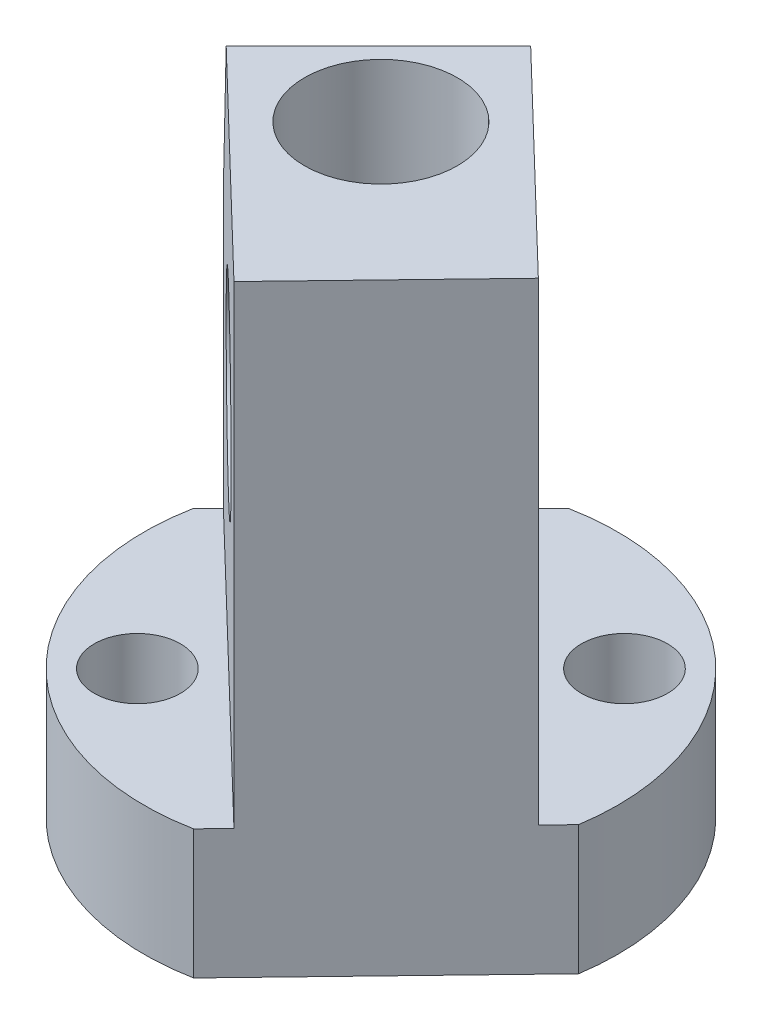
ISO-10303-21;
HEADER;
FILE_DESCRIPTION(('STEP AP214'),'2;1');
FILE_NAME('part.step','',(''),(''),'','','');
FILE_SCHEMA(('AUTOMOTIVE_DESIGN { 1 0 10303 214 1 1 1 1 }'));
ENDSEC;
DATA;
#1=APPLICATION_CONTEXT('core data for automotive mechanical design processes');
#2=APPLICATION_PROTOCOL_DEFINITION('international standard','automotive_design',2000,#1);
#3=PRODUCT_CONTEXT('',#1,'mechanical');
#4=PRODUCT('Part','Part','',(#3));
#5=PRODUCT_RELATED_PRODUCT_CATEGORY('part','',(#4));
#6=PRODUCT_DEFINITION_FORMATION('','',#4);
#7=PRODUCT_DEFINITION_CONTEXT('part definition',#1,'design');
#8=PRODUCT_DEFINITION('design','',#6,#7);
#9=PRODUCT_DEFINITION_SHAPE('','',#8);
#10=(LENGTH_UNIT() NAMED_UNIT(*) SI_UNIT(.MILLI.,.METRE.));
#11=(NAMED_UNIT(*) PLANE_ANGLE_UNIT() SI_UNIT($,.RADIAN.));
#12=(NAMED_UNIT(*) SI_UNIT($,.STERADIAN.) SOLID_ANGLE_UNIT());
#13=UNCERTAINTY_MEASURE_WITH_UNIT(LENGTH_MEASURE(1.E-05),#10,'distance_accuracy_value','');
#14=(GEOMETRIC_REPRESENTATION_CONTEXT(3) GLOBAL_UNCERTAINTY_ASSIGNED_CONTEXT((#13)) GLOBAL_UNIT_ASSIGNED_CONTEXT((#10,
#11,#12)) REPRESENTATION_CONTEXT('',''));
#15=CARTESIAN_POINT('',(0.,0.,0.));
#16=DIRECTION('',(0.,0.,1.));
#17=DIRECTION('',(1.,0.,0.));
#18=AXIS2_PLACEMENT_3D('',#15,#16,#17);
#19=CARTESIAN_POINT('',(0.,6.,0.));
#20=DIRECTION('',(0.,1.,0.));
#21=DIRECTION('',(0.,0.,1.));
#22=AXIS2_PLACEMENT_3D('',#19,#20,#21);
#23=PLANE('',#22);
#24=DIRECTION('',(0.707106781186547,0.,-0.707106781186547));
#25=VECTOR('',#24,1.);
#26=CARTESIAN_POINT('',(0.545569667866749,6.,-13.4058460167802));
#27=LINE('',#26,#25);
#28=CARTESIAN_POINT('',(-10.8065891404101,6.,-2.05368720850336));
#29=VERTEX_POINT('',#28);
#30=CARTESIAN_POINT('',(-10.0887922112917,6.,-2.77148413762175));
#31=VERTEX_POINT('',#30);
#32=EDGE_CURVE('E109',#29,#31,#27,.T.);
#33=ORIENTED_EDGE('',*,*,#32,.F.);
#34=CARTESIAN_POINT('',(0.,6.,0.));
#35=DIRECTION('',(0.,1.,0.));
#36=DIRECTION('',(0.,0.,1.));
#37=AXIS2_PLACEMENT_3D('',#34,#35,#36);
#38=CIRCLE('',#37,11.);
#39=CARTESIAN_POINT('',(2.09784639583294,6.,10.7981035603244));
#40=VERTEX_POINT('',#39);
#41=EDGE_CURVE('E119',#29,#40,#38,.T.);
#42=ORIENTED_EDGE('',*,*,#41,.T.);
#43=DIRECTION('',(-0.693512284784341,0.,0.720444800698293));
#44=VECTOR('',#43,1.);
#45=CARTESIAN_POINT('',(1.20429728995474,6.,11.7263536023532));
#46=LINE('',#45,#44);
#47=CARTESIAN_POINT('',(3.01644178236294,6.,9.84383456655053));
#48=VERTEX_POINT('',#47);
#49=EDGE_CURVE('E230',#48,#40,#46,.T.);
#50=ORIENTED_EDGE('',*,*,#49,.F.);
#51=DIRECTION('',(0.720444800698294,0.,0.69351228478434));
#52=VECTOR('',#51,1.);
#53=CARTESIAN_POINT('',(3.01644178236294,6.,9.84383456655053));
#54=LINE('',#53,#52);
#55=EDGE_CURVE('E122',#31,#48,#54,.T.);
#56=ORIENTED_EDGE('',*,*,#55,.F.);
#57=EDGE_LOOP('',(#33,#42,#50,#56));
#58=FACE_BOUND('',#57,.T.);
#59=CARTESIAN_POINT('',(-5.65685424949238,6.,5.65685424949238));
#60=DIRECTION('',(0.,1.,0.));
#61=DIRECTION('',(0.,0.,1.));
#62=AXIS2_PLACEMENT_3D('',#59,#60,#61);
#63=CIRCLE('',#62,1.99999999999999);
#64=CARTESIAN_POINT('',(-5.65685424949238,6.,7.65685424949237));
#65=VERTEX_POINT('',#64);
#66=EDGE_CURVE('E247',#65,#65,#63,.T.);
#67=ORIENTED_EDGE('',*,*,#66,.F.);
#68=EDGE_LOOP('',(#67));
#69=FACE_BOUND('',#68,.T.);
#70=ADVANCED_FACE('F33',(#58,#69),#23,.T.);
#71=CARTESIAN_POINT('',(0.,0.,0.));
#72=DIRECTION('',(0.,1.,0.));
#73=DIRECTION('',(0.,0.,1.));
#74=AXIS2_PLACEMENT_3D('',#71,#72,#73);
#75=CYLINDRICAL_SURFACE('',#74,11.);
#76=DIRECTION('',(0.,1.,0.));
#77=VECTOR('',#76,1.);
#78=CARTESIAN_POINT('',(-2.05368720850337,0.,-10.8065891404101));
#79=LINE('',#78,#77);
#80=CARTESIAN_POINT('',(-2.05368720850336,6.,-10.8065891404101));
#81=VERTEX_POINT('',#80);
#82=CARTESIAN_POINT('',(-2.05368720850337,0.,-10.8065891404101));
#83=VERTEX_POINT('',#82);
#84=EDGE_CURVE('E114',#81,#83,#79,.F.);
#85=ORIENTED_EDGE('',*,*,#84,.F.);
#86=CARTESIAN_POINT('',(10.8701600167363,6.,1.68511756579372));
#87=VERTEX_POINT('',#86);
#88=EDGE_CURVE('E129',#87,#81,#38,.T.);
#89=ORIENTED_EDGE('',*,*,#88,.F.);
#90=DIRECTION('',(0.,1.,0.));
#91=VECTOR('',#90,1.);
#92=CARTESIAN_POINT('',(10.8701600167363,0.,1.68511756579372));
#93=LINE('',#92,#91);
#94=CARTESIAN_POINT('',(10.8701600167363,0.,1.68511756579373));
#95=VERTEX_POINT('',#94);
#96=EDGE_CURVE('E152',#95,#87,#93,.T.);
#97=ORIENTED_EDGE('',*,*,#96,.F.);
#98=CARTESIAN_POINT('',(0.,0.,0.));
#99=DIRECTION('',(0.,1.,0.));
#100=DIRECTION('',(0.,0.,1.));
#101=AXIS2_PLACEMENT_3D('',#98,#99,#100);
#102=CIRCLE('',#101,11.);
#103=EDGE_CURVE('E138',#95,#83,#102,.T.);
#104=ORIENTED_EDGE('',*,*,#103,.T.);
#105=EDGE_LOOP('',(#85,#89,#97,#104));
#106=FACE_BOUND('',#105,.T.);
#107=ADVANCED_FACE('F159',(#106),#75,.T.);
#108=CARTESIAN_POINT('',(-3.01644178236293,6.,-9.84383456655054));
#109=VERTEX_POINT('',#108);
#110=EDGE_CURVE('E123',#109,#81,#27,.T.);
#111=ORIENTED_EDGE('',*,*,#110,.F.);
#112=DIRECTION('',(-0.720444800698293,0.,-0.693512284784341));
#113=VECTOR('',#112,1.);
#114=CARTESIAN_POINT('',(-3.01644178236293,6.,-9.84383456655054));
#115=LINE('',#114,#113);
#116=CARTESIAN_POINT('',(9.95156463020635,6.,2.6393865595676));
#117=VERTEX_POINT('',#116);
#118=EDGE_CURVE('E198',#117,#109,#115,.T.);
#119=ORIENTED_EDGE('',*,*,#118,.F.);
#120=EDGE_CURVE('E160',#87,#117,#46,.T.);
#121=ORIENTED_EDGE('',*,*,#120,.F.);
#122=ORIENTED_EDGE('',*,*,#88,.T.);
#123=EDGE_LOOP('',(#111,#119,#121,#122));
#124=FACE_BOUND('',#123,.T.);
#125=CARTESIAN_POINT('',(5.65685424949238,6.,-5.65685424949238));
#126=DIRECTION('',(0.,1.,0.));
#127=DIRECTION('',(0.,0.,1.));
#128=AXIS2_PLACEMENT_3D('',#125,#126,#127);
#129=CIRCLE('',#128,1.99999999999999);
#130=CARTESIAN_POINT('',(5.65685424949238,6.,-3.65685424949238));
#131=VERTEX_POINT('',#130);
#132=EDGE_CURVE('E237',#131,#131,#129,.T.);
#133=ORIENTED_EDGE('',*,*,#132,.F.);
#134=EDGE_LOOP('',(#133));
#135=FACE_BOUND('',#134,.T.);
#136=ADVANCED_FACE('F226',(#124,#135),#23,.T.);
#137=DIRECTION('',(0.,1.,0.));
#138=VECTOR('',#137,1.);
#139=CARTESIAN_POINT('',(-10.8065891404101,0.,-2.05368720850337));
#140=LINE('',#139,#138);
#141=CARTESIAN_POINT('',(-10.8065891404101,0.,-2.05368720850337));
#142=VERTEX_POINT('',#141);
#143=EDGE_CURVE('E106',#142,#29,#140,.T.);
#144=ORIENTED_EDGE('',*,*,#143,.F.);
#145=CARTESIAN_POINT('',(2.09784639583294,0.,10.7981035603244));
#146=VERTEX_POINT('',#145);
#147=EDGE_CURVE('E133',#142,#146,#102,.T.);
#148=ORIENTED_EDGE('',*,*,#147,.T.);
#149=DIRECTION('',(0.,1.,0.));
#150=VECTOR('',#149,1.);
#151=CARTESIAN_POINT('',(2.09784639583294,0.,10.7981035603244));
#152=LINE('',#151,#150);
#153=EDGE_CURVE('E128',#40,#146,#152,.F.);
#154=ORIENTED_EDGE('',*,*,#153,.F.);
#155=ORIENTED_EDGE('',*,*,#41,.F.);
#156=EDGE_LOOP('',(#144,#148,#154,#155));
#157=FACE_BOUND('',#156,.T.);
#158=ADVANCED_FACE('F126',(#157),#75,.T.);
#159=CARTESIAN_POINT('',(11.,0.,0.));
#160=DIRECTION('',(0.,-1.,0.));
#161=DIRECTION('',(0.,0.,-1.));
#162=AXIS2_PLACEMENT_3D('',#159,#160,#161);
#163=PLANE('',#162);
#164=DIRECTION('',(-0.707106781186548,0.,0.707106781186548));
#165=VECTOR('',#164,1.);
#166=CARTESIAN_POINT('',(-0.930138174456736,0.,-11.9301381744567));
#167=LINE('',#166,#165);
#168=EDGE_CURVE('E11',#83,#142,#167,.T.);
#169=ORIENTED_EDGE('',*,*,#168,.F.);
#170=ORIENTED_EDGE('',*,*,#103,.F.);
#171=DIRECTION('',(0.693512284784341,0.,-0.720444800698293));
#172=VECTOR('',#171,1.);
#173=CARTESIAN_POINT('',(11.7745553868994,0.,0.745600045333073));
#174=LINE('',#173,#172);
#175=EDGE_CURVE('E41',#146,#95,#174,.T.);
#176=ORIENTED_EDGE('',*,*,#175,.F.);
#177=ORIENTED_EDGE('',*,*,#147,.F.);
#178=EDGE_LOOP('',(#169,#170,#176,#177));
#179=FACE_BOUND('',#178,.T.);
#180=CARTESIAN_POINT('',(0.,0.,0.));
#181=DIRECTION('',(0.,-1.,0.));
#182=DIRECTION('',(0.,0.,-1.));
#183=AXIS2_PLACEMENT_3D('',#180,#181,#182);
#184=CIRCLE('',#183,3.99999999999999);
#185=CARTESIAN_POINT('',(0.,0.,-3.99999999999999));
#186=VERTEX_POINT('',#185);
#187=EDGE_CURVE('E170',#186,#186,#184,.T.);
#188=ORIENTED_EDGE('',*,*,#187,.F.);
#189=EDGE_LOOP('',(#188));
#190=FACE_BOUND('',#189,.T.);
#191=CARTESIAN_POINT('',(5.65685424949238,0.,-5.65685424949238));
#192=DIRECTION('',(0.,1.,0.));
#193=DIRECTION('',(0.,0.,1.));
#194=AXIS2_PLACEMENT_3D('',#191,#192,#193);
#195=CIRCLE('',#194,1.25000000000001);
#196=CARTESIAN_POINT('',(5.65685424949238,0.,-4.40685424949237));
#197=VERTEX_POINT('',#196);
#198=EDGE_CURVE('E174',#197,#197,#195,.T.);
#199=ORIENTED_EDGE('',*,*,#198,.T.);
#200=EDGE_LOOP('',(#199));
#201=FACE_BOUND('',#200,.T.);
#202=CARTESIAN_POINT('',(-5.65685424949238,0.,5.65685424949238));
#203=DIRECTION('',(0.,1.,0.));
#204=DIRECTION('',(0.,0.,1.));
#205=AXIS2_PLACEMENT_3D('',#202,#203,#204);
#206=CIRCLE('',#205,1.25000000000001);
#207=CARTESIAN_POINT('',(-5.65685424949238,0.,6.90685424949239));
#208=VERTEX_POINT('',#207);
#209=EDGE_CURVE('E177',#208,#208,#206,.T.);
#210=ORIENTED_EDGE('',*,*,#209,.T.);
#211=EDGE_LOOP('',(#210));
#212=FACE_BOUND('',#211,.T.);
#213=ADVANCED_FACE('F162',(#179,#190,#201,#212),#163,.T.);
#214=CARTESIAN_POINT('',(-3.01644178236293,28.,-9.84383456655054));
#215=DIRECTION('',(-0.693512284784341,0.,0.720444800698293));
#216=DIRECTION('',(0.720444800698293,0.,0.693512284784341));
#217=AXIS2_PLACEMENT_3D('',#214,#215,#216);
#218=PLANE('',#217);
#219=CARTESIAN_POINT('',(3.33033384283633,17.,-3.73432158154562));
#220=DIRECTION('',(-0.693512284784341,0.,0.720444800698293));
#221=DIRECTION('',(0.720444800698293,0.,0.693512284784341));
#222=AXIS2_PLACEMENT_3D('',#219,#220,#221);
#223=CIRCLE('',#222,4.25);
#224=CARTESIAN_POINT('',(6.39222424580407,17.,-0.786894371212175));
#225=VERTEX_POINT('',#224);
#226=EDGE_CURVE('E183',#225,#225,#223,.T.);
#227=ORIENTED_EDGE('',*,*,#226,.T.);
#228=EDGE_LOOP('',(#227));
#229=FACE_BOUND('',#228,.T.);
#230=DIRECTION('',(0.,-1.,0.));
#231=VECTOR('',#230,1.);
#232=CARTESIAN_POINT('',(-3.01644178236293,28.,-9.84383456655054));
#233=LINE('',#232,#231);
#234=CARTESIAN_POINT('',(-3.01644178236293,18.9999999999999,-9.84383456655054));
#235=VERTEX_POINT('',#234);
#236=EDGE_CURVE('E130',#235,#109,#233,.T.);
#237=ORIENTED_EDGE('',*,*,#236,.F.);
#238=DIRECTION('',(-0.338276172678976,-0.882912292521152,-0.325630334447987));
#239=VECTOR('',#238,1.);
#240=CARTESIAN_POINT('',(0.41691045904552,27.9611658855183,-6.53883194164332));
#241=LINE('',#240,#239);
#242=CARTESIAN_POINT('',(0.431789236617775,28.,-6.52450938005508));
#243=VERTEX_POINT('',#242);
#244=EDGE_CURVE('E146',#235,#243,#241,.F.);
#245=ORIENTED_EDGE('',*,*,#244,.T.);
#246=DIRECTION('',(-0.720444800698293,0.,-0.693512284784341));
#247=VECTOR('',#246,1.);
#248=CARTESIAN_POINT('',(-3.01644178236293,28.,-9.84383456655054));
#249=LINE('',#248,#247);
#250=CARTESIAN_POINT('',(9.95156463020635,28.,2.6393865595676));
#251=VERTEX_POINT('',#250);
#252=EDGE_CURVE('E199',#251,#243,#249,.T.);
#253=ORIENTED_EDGE('',*,*,#252,.F.);
#254=DIRECTION('',(0.,-1.,0.));
#255=VECTOR('',#254,1.);
#256=CARTESIAN_POINT('',(9.95156463020635,28.,2.6393865595676));
#257=LINE('',#256,#255);
#258=EDGE_CURVE('E206',#251,#117,#257,.T.);
#259=ORIENTED_EDGE('',*,*,#258,.T.);
#260=ORIENTED_EDGE('',*,*,#118,.T.);
#261=EDGE_LOOP('',(#237,#245,#253,#259,#260));
#262=FACE_BOUND('',#261,.T.);
#263=ADVANCED_FACE('F165',(#229,#262),#218,.F.);
#264=CARTESIAN_POINT('',(-10.0887922112917,28.,-2.77148413762175));
#265=DIRECTION('',(0.707106781186548,0.,0.707106781186547));
#266=DIRECTION('',(0.707106781186547,0.,-0.707106781186548));
#267=AXIS2_PLACEMENT_3D('',#264,#265,#266);
#268=PLANE('',#267);
#269=DIRECTION('',(0.,-1.,0.));
#270=VECTOR('',#269,1.);
#271=CARTESIAN_POINT('',(-10.0887922112917,28.,-2.77148413762175));
#272=LINE('',#271,#270);
#273=CARTESIAN_POINT('',(-10.0887922112917,18.9999999999999,-2.77148413762175));
#274=VERTEX_POINT('',#273);
#275=EDGE_CURVE('E134',#274,#31,#272,.T.);
#276=ORIENTED_EDGE('',*,*,#275,.F.);
#277=DIRECTION('',(0.707106781186547,0.,-0.707106781186548));
#278=VECTOR('',#277,1.);
#279=CARTESIAN_POINT('',(-10.0887922112917,18.9999999999999,-2.77148413762175));
#280=LINE('',#279,#278);
#281=EDGE_CURVE('E48',#274,#235,#280,.T.);
#282=ORIENTED_EDGE('',*,*,#281,.T.);
#283=ORIENTED_EDGE('',*,*,#236,.T.);
#284=ORIENTED_EDGE('',*,*,#110,.T.);
#285=ORIENTED_EDGE('',*,*,#84,.T.);
#286=ORIENTED_EDGE('',*,*,#168,.T.);
#287=ORIENTED_EDGE('',*,*,#143,.T.);
#288=ORIENTED_EDGE('',*,*,#32,.T.);
#289=EDGE_LOOP('',(#276,#282,#283,#284,#285,#286,#287,#288));
#290=FACE_BOUND('',#289,.T.);
#291=ADVANCED_FACE('F108',(#290),#268,.F.);
#292=CARTESIAN_POINT('',(3.01644178236294,28.,9.84383456655053));
#293=DIRECTION('',(0.69351228478434,0.,-0.720444800698294));
#294=DIRECTION('',(-0.720444800698294,0.,-0.69351228478434));
#295=AXIS2_PLACEMENT_3D('',#292,#293,#294);
#296=PLANE('',#295);
#297=CARTESIAN_POINT('',(-3.60478900500708,17.,3.47012642543732));
#298=DIRECTION('',(-0.693512284784341,0.,0.720444800698293));
#299=DIRECTION('',(0.720444800698293,0.,0.693512284784341));
#300=AXIS2_PLACEMENT_3D('',#297,#298,#299);
#301=CIRCLE('',#300,4.25);
#302=CARTESIAN_POINT('',(-0.542898602039338,17.,6.41755363577076));
#303=VERTEX_POINT('',#302);
#304=EDGE_CURVE('E179',#303,#303,#301,.T.);
#305=ORIENTED_EDGE('',*,*,#304,.F.);
#306=EDGE_LOOP('',(#305));
#307=FACE_BOUND('',#306,.T.);
#308=DIRECTION('',(0.720444800698294,0.,0.69351228478434));
#309=VECTOR('',#308,1.);
#310=CARTESIAN_POINT('',(3.01644178236294,28.,9.84383456655053));
#311=LINE('',#310,#309);
#312=CARTESIAN_POINT('',(-6.64056119231101,28.,0.547841048873714));
#313=VERTEX_POINT('',#312);
#314=CARTESIAN_POINT('',(3.01644178236294,28.,9.84383456655053));
#315=VERTEX_POINT('',#314);
#316=EDGE_CURVE('E202',#313,#315,#311,.T.);
#317=ORIENTED_EDGE('',*,*,#316,.F.);
#318=DIRECTION('',(0.338276172678976,0.882912292521152,0.325630334447987));
#319=VECTOR('',#318,1.);
#320=CARTESIAN_POINT('',(-6.6251859699492,28.0401298522328,0.562641496567792));
#321=LINE('',#320,#319);
#322=EDGE_CURVE('E56',#313,#274,#321,.F.);
#323=ORIENTED_EDGE('',*,*,#322,.T.);
#324=ORIENTED_EDGE('',*,*,#275,.T.);
#325=ORIENTED_EDGE('',*,*,#55,.T.);
#326=DIRECTION('',(0.,-1.,0.));
#327=VECTOR('',#326,1.);
#328=CARTESIAN_POINT('',(3.01644178236294,28.,9.84383456655053));
#329=LINE('',#328,#327);
#330=EDGE_CURVE('E212',#315,#48,#329,.T.);
#331=ORIENTED_EDGE('',*,*,#330,.F.);
#332=EDGE_LOOP('',(#317,#323,#324,#325,#331));
#333=FACE_BOUND('',#332,.T.);
#334=ADVANCED_FACE('F213',(#307,#333),#296,.F.);
#335=CARTESIAN_POINT('',(9.95156463020635,28.,2.6393865595676));
#336=DIRECTION('',(-0.720444800698293,0.,-0.693512284784341));
#337=DIRECTION('',(-0.693512284784341,0.,0.720444800698293));
#338=AXIS2_PLACEMENT_3D('',#335,#336,#337);
#339=PLANE('',#338);
#340=ORIENTED_EDGE('',*,*,#330,.T.);
#341=ORIENTED_EDGE('',*,*,#49,.T.);
#342=ORIENTED_EDGE('',*,*,#153,.T.);
#343=ORIENTED_EDGE('',*,*,#175,.T.);
#344=ORIENTED_EDGE('',*,*,#96,.T.);
#345=ORIENTED_EDGE('',*,*,#120,.T.);
#346=ORIENTED_EDGE('',*,*,#258,.F.);
#347=DIRECTION('',(0.693512284784341,0.,-0.720444800698293));
#348=VECTOR('',#347,1.);
#349=CARTESIAN_POINT('',(9.95156463020635,28.,2.6393865595676));
#350=LINE('',#349,#348);
#351=EDGE_CURVE('E204',#315,#251,#350,.T.);
#352=ORIENTED_EDGE('',*,*,#351,.F.);
#353=EDGE_LOOP('',(#340,#341,#342,#343,#344,#345,#346,#352));
#354=FACE_BOUND('',#353,.T.);
#355=ADVANCED_FACE('F151',(#354),#339,.F.);
#356=CARTESIAN_POINT('',(0.,28.,0.));
#357=DIRECTION('',(0.,-1.,0.));
#358=DIRECTION('',(0.,0.,-1.));
#359=AXIS2_PLACEMENT_3D('',#356,#357,#358);
#360=PLANE('',#359);
#361=CARTESIAN_POINT('',(0.,28.,0.));
#362=DIRECTION('',(0.,1.,0.));
#363=DIRECTION('',(0.,0.,1.));
#364=AXIS2_PLACEMENT_3D('',#361,#362,#363);
#365=CIRCLE('',#364,3.54999999999999);
#366=CARTESIAN_POINT('',(0.,28.,3.54999999999999));
#367=VERTEX_POINT('',#366);
#368=EDGE_CURVE('E192',#367,#367,#365,.T.);
#369=ORIENTED_EDGE('',*,*,#368,.F.);
#370=EDGE_LOOP('',(#369));
#371=FACE_BOUND('',#370,.T.);
#372=ORIENTED_EDGE('',*,*,#252,.T.);
#373=DIRECTION('',(-0.707106781186547,0.,0.707106781186548));
#374=VECTOR('',#373,1.);
#375=CARTESIAN_POINT('',(-3.04636007171865,28.,-3.04636007171865));
#376=LINE('',#375,#374);
#377=EDGE_CURVE('E141',#243,#313,#376,.T.);
#378=ORIENTED_EDGE('',*,*,#377,.T.);
#379=ORIENTED_EDGE('',*,*,#316,.T.);
#380=ORIENTED_EDGE('',*,*,#351,.T.);
#381=EDGE_LOOP('',(#372,#378,#379,#380));
#382=FACE_BOUND('',#381,.T.);
#383=ADVANCED_FACE('F221',(#371,#382),#360,.F.);
#384=CARTESIAN_POINT('',(0.,22.,0.));
#385=DIRECTION('',(0.,-1.,0.));
#386=DIRECTION('',(0.,0.,-1.));
#387=AXIS2_PLACEMENT_3D('',#384,#385,#386);
#388=PLANE('',#387);
#389=CARTESIAN_POINT('',(0.,22.,0.));
#390=DIRECTION('',(0.,1.,0.));
#391=DIRECTION('',(0.,0.,1.));
#392=AXIS2_PLACEMENT_3D('',#389,#390,#391);
#393=CIRCLE('',#392,3.54999999999999);
#394=CARTESIAN_POINT('',(0.,22.,3.54999999999999));
#395=VERTEX_POINT('',#394);
#396=EDGE_CURVE('E195',#395,#395,#393,.T.);
#397=ORIENTED_EDGE('',*,*,#396,.T.);
#398=EDGE_LOOP('',(#397));
#399=FACE_BOUND('',#398,.T.);
#400=ADVANCED_FACE('F307',(#399),#388,.F.);
#401=CARTESIAN_POINT('',(0.,28.,0.));
#402=DIRECTION('',(0.,1.,0.));
#403=DIRECTION('',(0.,0.,1.));
#404=AXIS2_PLACEMENT_3D('',#401,#402,#403);
#405=CYLINDRICAL_SURFACE('',#404,3.54999999999999);
#406=ORIENTED_EDGE('',*,*,#396,.F.);
#407=EDGE_LOOP('',(#406));
#408=FACE_BOUND('',#407,.T.);
#409=ORIENTED_EDGE('',*,*,#368,.T.);
#410=EDGE_LOOP('',(#409));
#411=FACE_BOUND('',#410,.T.);
#412=ADVANCED_FACE('F317',(#408,#411),#405,.F.);
#413=CARTESIAN_POINT('',(-3.60478900500708,17.,3.47012642543732));
#414=DIRECTION('',(-0.693512284784341,0.,0.720444800698293));
#415=DIRECTION('',(0.720444800698293,0.,0.693512284784341));
#416=AXIS2_PLACEMENT_3D('',#413,#414,#415);
#417=CYLINDRICAL_SURFACE('',#416,4.25);
#418=ORIENTED_EDGE('',*,*,#304,.T.);
#419=EDGE_LOOP('',(#418));
#420=FACE_BOUND('',#419,.T.);
#421=ORIENTED_EDGE('',*,*,#226,.F.);
#422=EDGE_LOOP('',(#421));
#423=FACE_BOUND('',#422,.T.);
#424=ADVANCED_FACE('F325',(#420,#423),#417,.F.);
#425=CARTESIAN_POINT('',(-5.65685424949238,6.,5.65685424949238));
#426=DIRECTION('',(0.,1.,0.));
#427=DIRECTION('',(0.,0.,1.));
#428=AXIS2_PLACEMENT_3D('',#425,#426,#427);
#429=CYLINDRICAL_SURFACE('',#428,1.25000000000001);
#430=ORIENTED_EDGE('',*,*,#209,.F.);
#431=EDGE_LOOP('',(#430));
#432=FACE_BOUND('',#431,.T.);
#433=CARTESIAN_POINT('',(-5.65685424949238,1.5,5.65685424949238));
#434=DIRECTION('',(0.,1.,0.));
#435=DIRECTION('',(0.,0.,1.));
#436=AXIS2_PLACEMENT_3D('',#433,#434,#435);
#437=CIRCLE('',#436,1.25000000000001);
#438=CARTESIAN_POINT('',(-5.65685424949238,1.5,6.90685424949239));
#439=VERTEX_POINT('',#438);
#440=EDGE_CURVE('E180',#439,#439,#437,.T.);
#441=ORIENTED_EDGE('',*,*,#440,.T.);
#442=EDGE_LOOP('',(#441));
#443=FACE_BOUND('',#442,.T.);
#444=ADVANCED_FACE('F333',(#432,#443),#429,.F.);
#445=CARTESIAN_POINT('',(-4.40685424949237,1.5,5.65685424949238));
#446=DIRECTION('',(0.,-1.,0.));
#447=DIRECTION('',(0.,0.,-1.));
#448=AXIS2_PLACEMENT_3D('',#445,#446,#447);
#449=PLANE('',#448);
#450=ORIENTED_EDGE('',*,*,#440,.F.);
#451=EDGE_LOOP('',(#450));
#452=FACE_BOUND('',#451,.T.);
#453=CARTESIAN_POINT('',(-5.65685424949238,1.5,5.65685424949238));
#454=DIRECTION('',(0.,1.,0.));
#455=DIRECTION('',(0.,0.,1.));
#456=AXIS2_PLACEMENT_3D('',#453,#454,#455);
#457=CIRCLE('',#456,1.99999999999999);
#458=CARTESIAN_POINT('',(-5.65685424949238,1.5,7.65685424949237));
#459=VERTEX_POINT('',#458);
#460=EDGE_CURVE('E186',#459,#459,#457,.T.);
#461=ORIENTED_EDGE('',*,*,#460,.T.);
#462=EDGE_LOOP('',(#461));
#463=FACE_BOUND('',#462,.T.);
#464=ADVANCED_FACE('F252',(#452,#463),#449,.F.);
#465=CARTESIAN_POINT('',(-5.65685424949238,6.,5.65685424949238));
#466=DIRECTION('',(0.,1.,0.));
#467=DIRECTION('',(0.,0.,1.));
#468=AXIS2_PLACEMENT_3D('',#465,#466,#467);
#469=CYLINDRICAL_SURFACE('',#468,1.99999999999999);
#470=ORIENTED_EDGE('',*,*,#460,.F.);
#471=EDGE_LOOP('',(#470));
#472=FACE_BOUND('',#471,.T.);
#473=ORIENTED_EDGE('',*,*,#66,.T.);
#474=EDGE_LOOP('',(#473));
#475=FACE_BOUND('',#474,.T.);
#476=ADVANCED_FACE('F254',(#472,#475),#469,.F.);
#477=CARTESIAN_POINT('',(5.65685424949238,6.,-5.65685424949238));
#478=DIRECTION('',(0.,1.,0.));
#479=DIRECTION('',(0.,0.,1.));
#480=AXIS2_PLACEMENT_3D('',#477,#478,#479);
#481=CYLINDRICAL_SURFACE('',#480,1.25000000000001);
#482=ORIENTED_EDGE('',*,*,#198,.F.);
#483=EDGE_LOOP('',(#482));
#484=FACE_BOUND('',#483,.T.);
#485=CARTESIAN_POINT('',(5.65685424949238,1.5,-5.65685424949238));
#486=DIRECTION('',(0.,1.,0.));
#487=DIRECTION('',(0.,0.,1.));
#488=AXIS2_PLACEMENT_3D('',#485,#486,#487);
#489=CIRCLE('',#488,1.25000000000001);
#490=CARTESIAN_POINT('',(5.65685424949238,1.5,-4.40685424949237));
#491=VERTEX_POINT('',#490);
#492=EDGE_CURVE('E243',#491,#491,#489,.T.);
#493=ORIENTED_EDGE('',*,*,#492,.T.);
#494=EDGE_LOOP('',(#493));
#495=FACE_BOUND('',#494,.T.);
#496=ADVANCED_FACE('F257',(#484,#495),#481,.F.);
#497=CARTESIAN_POINT('',(6.90685424949239,1.5,-5.65685424949238));
#498=DIRECTION('',(0.,-1.,0.));
#499=DIRECTION('',(0.,0.,-1.));
#500=AXIS2_PLACEMENT_3D('',#497,#498,#499);
#501=PLANE('',#500);
#502=ORIENTED_EDGE('',*,*,#492,.F.);
#503=EDGE_LOOP('',(#502));
#504=FACE_BOUND('',#503,.T.);
#505=CARTESIAN_POINT('',(5.65685424949238,1.5,-5.65685424949238));
#506=DIRECTION('',(0.,1.,0.));
#507=DIRECTION('',(0.,0.,1.));
#508=AXIS2_PLACEMENT_3D('',#505,#506,#507);
#509=CIRCLE('',#508,1.99999999999999);
#510=CARTESIAN_POINT('',(5.65685424949238,1.5,-3.65685424949238));
#511=VERTEX_POINT('',#510);
#512=EDGE_CURVE('E240',#511,#511,#509,.T.);
#513=ORIENTED_EDGE('',*,*,#512,.T.);
#514=EDGE_LOOP('',(#513));
#515=FACE_BOUND('',#514,.T.);
#516=ADVANCED_FACE('F358',(#504,#515),#501,.F.);
#517=CARTESIAN_POINT('',(5.65685424949238,6.,-5.65685424949238));
#518=DIRECTION('',(0.,1.,0.));
#519=DIRECTION('',(0.,0.,1.));
#520=AXIS2_PLACEMENT_3D('',#517,#518,#519);
#521=CYLINDRICAL_SURFACE('',#520,1.99999999999999);
#522=ORIENTED_EDGE('',*,*,#512,.F.);
#523=EDGE_LOOP('',(#522));
#524=FACE_BOUND('',#523,.T.);
#525=ORIENTED_EDGE('',*,*,#132,.T.);
#526=EDGE_LOOP('',(#525));
#527=FACE_BOUND('',#526,.T.);
#528=ADVANCED_FACE('F366',(#524,#527),#521,.F.);
#529=CARTESIAN_POINT('',(0.,2.,0.));
#530=DIRECTION('',(0.,-1.,0.));
#531=DIRECTION('',(0.,0.,-1.));
#532=AXIS2_PLACEMENT_3D('',#529,#530,#531);
#533=CONICAL_SURFACE('',#532,3.99999999999999,0.785398163397448);
#534=CARTESIAN_POINT('',(0.,5.99999999999999,0.));
#535=VERTEX_POINT('',#534);
#536=VERTEX_LOOP('',#535);
#537=FACE_BOUND('',#536,.T.);
#538=CARTESIAN_POINT('',(0.,2.,0.));
#539=DIRECTION('',(0.,-1.,0.));
#540=DIRECTION('',(0.,0.,-1.));
#541=AXIS2_PLACEMENT_3D('',#538,#539,#540);
#542=CIRCLE('',#541,3.99999999999999);
#543=CARTESIAN_POINT('',(0.,2.,-3.99999999999999));
#544=VERTEX_POINT('',#543);
#545=EDGE_CURVE('E234',#544,#544,#542,.T.);
#546=ORIENTED_EDGE('',*,*,#545,.T.);
#547=EDGE_LOOP('',(#546));
#548=FACE_BOUND('',#547,.T.);
#549=ADVANCED_FACE('F374',(#537,#548),#533,.F.);
#550=CARTESIAN_POINT('',(0.,0.,0.));
#551=DIRECTION('',(0.,-1.,0.));
#552=DIRECTION('',(0.,0.,-1.));
#553=AXIS2_PLACEMENT_3D('',#550,#551,#552);
#554=CYLINDRICAL_SURFACE('',#553,3.99999999999999);
#555=ORIENTED_EDGE('',*,*,#545,.F.);
#556=EDGE_LOOP('',(#555));
#557=FACE_BOUND('',#556,.T.);
#558=ORIENTED_EDGE('',*,*,#187,.T.);
#559=EDGE_LOOP('',(#558));
#560=FACE_BOUND('',#559,.T.);
#561=ADVANCED_FACE('F382',(#557,#560),#554,.F.);
#562=CARTESIAN_POINT('',(-3.04636007171865,28.,-3.04636007171865));
#563=DIRECTION('',(0.624338230342887,-0.469471562785888,0.624338230342887));
#564=DIRECTION('',(-0.707106781186547,0.,0.707106781186548));
#565=AXIS2_PLACEMENT_3D('',#562,#563,#564);
#566=PLANE('',#565);
#567=ORIENTED_EDGE('',*,*,#244,.F.);
#568=ORIENTED_EDGE('',*,*,#281,.F.);
#569=ORIENTED_EDGE('',*,*,#322,.F.);
#570=ORIENTED_EDGE('',*,*,#377,.F.);
#571=EDGE_LOOP('',(#567,#568,#569,#570));
#572=FACE_BOUND('',#571,.T.);
#573=ADVANCED_FACE('F35',(#572),#566,.F.);
#574=CLOSED_SHELL('',(#70,#107,#136,#158,#213,#263,#291,#334,#355,#383,#400,#412,#424,#444,#464,
#476,#496,#516,#528,#549,#561,#573));
#575=MANIFOLD_SOLID_BREP('B2',#574);
#576=ADVANCED_BREP_SHAPE_REPRESENTATION('',(#18,#575),#14);
#577=SHAPE_DEFINITION_REPRESENTATION(#9,#576);
ENDSEC;
END-ISO-10303-21;
